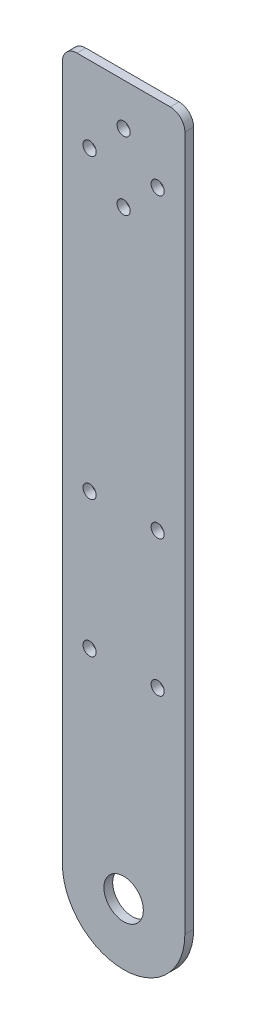
ISO-10303-21;
HEADER;
FILE_DESCRIPTION(('STEP AP214'),'2;1');
FILE_NAME('part.step','',(''),(''),'','','');
FILE_SCHEMA(('AUTOMOTIVE_DESIGN { 1 0 10303 214 1 1 1 1 }'));
ENDSEC;
DATA;
#1=APPLICATION_CONTEXT('core data for automotive mechanical design processes');
#2=APPLICATION_PROTOCOL_DEFINITION('international standard','automotive_design',2000,#1);
#3=PRODUCT_CONTEXT('',#1,'mechanical');
#4=PRODUCT('Part','Part','',(#3));
#5=PRODUCT_RELATED_PRODUCT_CATEGORY('part','',(#4));
#6=PRODUCT_DEFINITION_FORMATION('','',#4);
#7=PRODUCT_DEFINITION_CONTEXT('part definition',#1,'design');
#8=PRODUCT_DEFINITION('design','',#6,#7);
#9=PRODUCT_DEFINITION_SHAPE('','',#8);
#10=(LENGTH_UNIT() NAMED_UNIT(*) SI_UNIT(.MILLI.,.METRE.));
#11=(NAMED_UNIT(*) PLANE_ANGLE_UNIT() SI_UNIT($,.RADIAN.));
#12=(NAMED_UNIT(*) SI_UNIT($,.STERADIAN.) SOLID_ANGLE_UNIT());
#13=UNCERTAINTY_MEASURE_WITH_UNIT(LENGTH_MEASURE(1.E-05),#10,'distance_accuracy_value','');
#14=(GEOMETRIC_REPRESENTATION_CONTEXT(3) GLOBAL_UNCERTAINTY_ASSIGNED_CONTEXT((#13)) GLOBAL_UNIT_ASSIGNED_CONTEXT((#10,
#11,#12)) REPRESENTATION_CONTEXT('',''));
#15=CARTESIAN_POINT('',(0.,0.,0.));
#16=DIRECTION('',(0.,0.,1.));
#17=DIRECTION('',(1.,0.,0.));
#18=AXIS2_PLACEMENT_3D('',#15,#16,#17);
#19=CARTESIAN_POINT('',(0.,0.,1.8));
#20=DIRECTION('',(0.,0.,1.));
#21=DIRECTION('',(1.,0.,0.));
#22=AXIS2_PLACEMENT_3D('',#19,#20,#21);
#23=PLANE('',#22);
#24=CARTESIAN_POINT('',(0.,123.185826180637,1.8));
#25=DIRECTION('',(0.,0.,1.));
#26=DIRECTION('',(-1.,0.,0.));
#27=AXIS2_PLACEMENT_3D('',#24,#25,#26);
#28=CIRCLE('',#27,1.35);
#29=CARTESIAN_POINT('',(-1.35,123.185826180637,1.8));
#30=VERTEX_POINT('',#29);
#31=EDGE_CURVE('E220',#30,#30,#28,.T.);
#32=ORIENTED_EDGE('',*,*,#31,.F.);
#33=EDGE_LOOP('',(#32));
#34=FACE_BOUND('',#33,.T.);
#35=CARTESIAN_POINT('',(0.,137.185826180637,1.8));
#36=DIRECTION('',(0.,0.,1.));
#37=DIRECTION('',(1.,0.,0.));
#38=AXIS2_PLACEMENT_3D('',#35,#36,#37);
#39=CIRCLE('',#38,1.35);
#40=CARTESIAN_POINT('',(1.35,137.185826180637,1.8));
#41=VERTEX_POINT('',#40);
#42=EDGE_CURVE('E204',#41,#41,#39,.T.);
#43=ORIENTED_EDGE('',*,*,#42,.F.);
#44=EDGE_LOOP('',(#43));
#45=FACE_BOUND('',#44,.T.);
#46=CARTESIAN_POINT('',(-6.99999999999998,69.0899815954447,1.8));
#47=DIRECTION('',(0.,0.,1.));
#48=DIRECTION('',(-1.,0.,0.));
#49=AXIS2_PLACEMENT_3D('',#46,#47,#48);
#50=CIRCLE('',#49,1.35);
#51=CARTESIAN_POINT('',(-8.34999999999998,69.0899815954447,1.8));
#52=VERTEX_POINT('',#51);
#53=EDGE_CURVE('E188',#52,#52,#50,.T.);
#54=ORIENTED_EDGE('',*,*,#53,.F.);
#55=EDGE_LOOP('',(#54));
#56=FACE_BOUND('',#55,.T.);
#57=CARTESIAN_POINT('',(7.,69.0899815954447,1.8));
#58=DIRECTION('',(0.,0.,1.));
#59=DIRECTION('',(1.,0.,0.));
#60=AXIS2_PLACEMENT_3D('',#57,#58,#59);
#61=CIRCLE('',#60,1.35);
#62=CARTESIAN_POINT('',(8.35,69.0899815954447,1.8));
#63=VERTEX_POINT('',#62);
#64=EDGE_CURVE('E172',#63,#63,#61,.T.);
#65=ORIENTED_EDGE('',*,*,#64,.F.);
#66=EDGE_LOOP('',(#65));
#67=FACE_BOUND('',#66,.T.);
#68=DIRECTION('',(-1.,0.,0.));
#69=VECTOR('',#68,1.);
#70=CARTESIAN_POINT('',(-12.5961749377996,145.832394840701,1.8));
#71=LINE('',#70,#69);
#72=CARTESIAN_POINT('',(9.59617493779956,145.832394840701,1.8));
#73=VERTEX_POINT('',#72);
#74=CARTESIAN_POINT('',(-9.59617493779957,145.832394840701,1.8));
#75=VERTEX_POINT('',#74);
#76=EDGE_CURVE('E105',#73,#75,#71,.T.);
#77=ORIENTED_EDGE('',*,*,#76,.T.);
#78=CARTESIAN_POINT('',(-9.59617493779957,142.832394840701,1.8));
#79=DIRECTION('',(0.,0.,1.));
#80=DIRECTION('',(1.,0.,0.));
#81=AXIS2_PLACEMENT_3D('',#78,#79,#80);
#82=CIRCLE('',#81,3.);
#83=CARTESIAN_POINT('',(-12.5961749377996,142.832394840701,1.8));
#84=VERTEX_POINT('',#83);
#85=EDGE_CURVE('E11',#75,#84,#82,.T.);
#86=ORIENTED_EDGE('',*,*,#85,.T.);
#87=DIRECTION('',(0.,-1.,0.));
#88=VECTOR('',#87,1.);
#89=CARTESIAN_POINT('',(-12.5961749377996,0.,1.8));
#90=LINE('',#89,#88);
#91=CARTESIAN_POINT('',(-12.5961749377996,0.,1.8));
#92=VERTEX_POINT('',#91);
#93=EDGE_CURVE('E111',#84,#92,#90,.T.);
#94=ORIENTED_EDGE('',*,*,#93,.T.);
#95=CARTESIAN_POINT('',(0.,0.,1.8));
#96=DIRECTION('',(0.,0.,1.));
#97=DIRECTION('',(1.,0.,0.));
#98=AXIS2_PLACEMENT_3D('',#95,#96,#97);
#99=CIRCLE('',#98,12.5961749377996);
#100=CARTESIAN_POINT('',(12.5961749377996,0.,1.8));
#101=VERTEX_POINT('',#100);
#102=EDGE_CURVE('E106',#92,#101,#99,.T.);
#103=ORIENTED_EDGE('',*,*,#102,.T.);
#104=DIRECTION('',(0.,1.,0.));
#105=VECTOR('',#104,1.);
#106=CARTESIAN_POINT('',(12.5961749377996,145.832394840701,1.8));
#107=LINE('',#106,#105);
#108=CARTESIAN_POINT('',(12.5961749377996,142.832394840701,1.8));
#109=VERTEX_POINT('',#108);
#110=EDGE_CURVE('E93',#101,#109,#107,.T.);
#111=ORIENTED_EDGE('',*,*,#110,.T.);
#112=CARTESIAN_POINT('',(9.59617493779957,142.832394840701,1.8));
#113=DIRECTION('',(0.,0.,1.));
#114=DIRECTION('',(1.,0.,0.));
#115=AXIS2_PLACEMENT_3D('',#112,#113,#114);
#116=CIRCLE('',#115,3.);
#117=EDGE_CURVE('E137',#109,#73,#116,.T.);
#118=ORIENTED_EDGE('',*,*,#117,.T.);
#119=EDGE_LOOP('',(#77,#86,#94,#103,#111,#118));
#120=FACE_BOUND('',#119,.T.);
#121=CARTESIAN_POINT('',(7.,41.0899815954447,1.8));
#122=DIRECTION('',(0.,0.,1.));
#123=DIRECTION('',(1.,0.,0.));
#124=AXIS2_PLACEMENT_3D('',#121,#122,#123);
#125=CIRCLE('',#124,1.35);
#126=CARTESIAN_POINT('',(8.35,41.0899815954447,1.8));
#127=VERTEX_POINT('',#126);
#128=EDGE_CURVE('E163',#127,#127,#125,.T.);
#129=ORIENTED_EDGE('',*,*,#128,.F.);
#130=EDGE_LOOP('',(#129));
#131=FACE_BOUND('',#130,.T.);
#132=CARTESIAN_POINT('',(-6.99999999999998,41.0899815954447,1.8));
#133=DIRECTION('',(0.,0.,1.));
#134=DIRECTION('',(-1.,0.,0.));
#135=AXIS2_PLACEMENT_3D('',#132,#133,#134);
#136=CIRCLE('',#135,1.35);
#137=CARTESIAN_POINT('',(-8.34999999999997,41.0899815954447,1.8));
#138=VERTEX_POINT('',#137);
#139=EDGE_CURVE('E180',#138,#138,#136,.T.);
#140=ORIENTED_EDGE('',*,*,#139,.F.);
#141=EDGE_LOOP('',(#140));
#142=FACE_BOUND('',#141,.T.);
#143=CARTESIAN_POINT('',(7.,130.185826180637,1.8));
#144=DIRECTION('',(0.,0.,1.));
#145=DIRECTION('',(1.,0.,0.));
#146=AXIS2_PLACEMENT_3D('',#143,#144,#145);
#147=CIRCLE('',#146,1.35);
#148=CARTESIAN_POINT('',(8.35,130.185826180637,1.8));
#149=VERTEX_POINT('',#148);
#150=EDGE_CURVE('E196',#149,#149,#147,.T.);
#151=ORIENTED_EDGE('',*,*,#150,.F.);
#152=EDGE_LOOP('',(#151));
#153=FACE_BOUND('',#152,.T.);
#154=CARTESIAN_POINT('',(-7.,130.185826180637,1.8));
#155=DIRECTION('',(0.,0.,1.));
#156=DIRECTION('',(-1.,0.,0.));
#157=AXIS2_PLACEMENT_3D('',#154,#155,#156);
#158=CIRCLE('',#157,1.35);
#159=CARTESIAN_POINT('',(-8.35,130.185826180637,1.8));
#160=VERTEX_POINT('',#159);
#161=EDGE_CURVE('E212',#160,#160,#158,.T.);
#162=ORIENTED_EDGE('',*,*,#161,.F.);
#163=EDGE_LOOP('',(#162));
#164=FACE_BOUND('',#163,.T.);
#165=CARTESIAN_POINT('',(0.,0.,1.8));
#166=DIRECTION('',(0.,0.,1.));
#167=DIRECTION('',(1.,0.,0.));
#168=AXIS2_PLACEMENT_3D('',#165,#166,#167);
#169=CIRCLE('',#168,4.05);
#170=CARTESIAN_POINT('',(4.05,0.,1.8));
#171=VERTEX_POINT('',#170);
#172=EDGE_CURVE('E228',#171,#171,#169,.T.);
#173=ORIENTED_EDGE('',*,*,#172,.F.);
#174=EDGE_LOOP('',(#173));
#175=FACE_BOUND('',#174,.T.);
#176=ADVANCED_FACE('F39',(#34,#45,#56,#67,#120,#131,#142,#153,#164,#175),#23,.T.);
#177=CARTESIAN_POINT('',(0.,0.,0.));
#178=DIRECTION('',(0.,0.,1.));
#179=DIRECTION('',(1.,0.,0.));
#180=AXIS2_PLACEMENT_3D('',#177,#178,#179);
#181=PLANE('',#180);
#182=DIRECTION('',(0.,-1.,0.));
#183=VECTOR('',#182,1.);
#184=CARTESIAN_POINT('',(-12.5961749377996,0.,0.));
#185=LINE('',#184,#183);
#186=CARTESIAN_POINT('',(-12.5961749377996,142.832394840701,0.));
#187=VERTEX_POINT('',#186);
#188=CARTESIAN_POINT('',(-12.5961749377996,0.,0.));
#189=VERTEX_POINT('',#188);
#190=EDGE_CURVE('E116',#187,#189,#185,.T.);
#191=ORIENTED_EDGE('',*,*,#190,.F.);
#192=CARTESIAN_POINT('',(-9.59617493779957,142.832394840701,0.));
#193=DIRECTION('',(0.,0.,1.));
#194=DIRECTION('',(1.,0.,0.));
#195=AXIS2_PLACEMENT_3D('',#192,#193,#194);
#196=CIRCLE('',#195,3.);
#197=CARTESIAN_POINT('',(-9.59617493779957,145.832394840701,0.));
#198=VERTEX_POINT('',#197);
#199=EDGE_CURVE('E62',#187,#198,#196,.F.);
#200=ORIENTED_EDGE('',*,*,#199,.T.);
#201=DIRECTION('',(-1.,0.,0.));
#202=VECTOR('',#201,1.);
#203=CARTESIAN_POINT('',(-12.5961749377996,145.832394840701,0.));
#204=LINE('',#203,#202);
#205=CARTESIAN_POINT('',(9.59617493779956,145.832394840701,0.));
#206=VERTEX_POINT('',#205);
#207=EDGE_CURVE('E154',#206,#198,#204,.T.);
#208=ORIENTED_EDGE('',*,*,#207,.F.);
#209=CARTESIAN_POINT('',(9.59617493779957,142.832394840701,0.));
#210=DIRECTION('',(0.,0.,1.));
#211=DIRECTION('',(1.,0.,0.));
#212=AXIS2_PLACEMENT_3D('',#209,#210,#211);
#213=CIRCLE('',#212,3.);
#214=CARTESIAN_POINT('',(12.5961749377996,142.832394840701,0.));
#215=VERTEX_POINT('',#214);
#216=EDGE_CURVE('E128',#206,#215,#213,.F.);
#217=ORIENTED_EDGE('',*,*,#216,.T.);
#218=DIRECTION('',(0.,1.,0.));
#219=VECTOR('',#218,1.);
#220=CARTESIAN_POINT('',(12.5961749377996,145.832394840701,0.));
#221=LINE('',#220,#219);
#222=CARTESIAN_POINT('',(12.5961749377996,0.,0.));
#223=VERTEX_POINT('',#222);
#224=EDGE_CURVE('E156',#223,#215,#221,.T.);
#225=ORIENTED_EDGE('',*,*,#224,.F.);
#226=CARTESIAN_POINT('',(0.,0.,0.));
#227=DIRECTION('',(0.,0.,1.));
#228=DIRECTION('',(1.,0.,0.));
#229=AXIS2_PLACEMENT_3D('',#226,#227,#228);
#230=CIRCLE('',#229,12.5961749377996);
#231=EDGE_CURVE('E120',#189,#223,#230,.T.);
#232=ORIENTED_EDGE('',*,*,#231,.F.);
#233=EDGE_LOOP('',(#191,#200,#208,#217,#225,#232));
#234=FACE_BOUND('',#233,.T.);
#235=CARTESIAN_POINT('',(7.,41.0899815954447,0.));
#236=DIRECTION('',(0.,0.,1.));
#237=DIRECTION('',(1.,0.,0.));
#238=AXIS2_PLACEMENT_3D('',#235,#236,#237);
#239=CIRCLE('',#238,1.35);
#240=CARTESIAN_POINT('',(8.35,41.0899815954447,0.));
#241=VERTEX_POINT('',#240);
#242=EDGE_CURVE('E168',#241,#241,#239,.T.);
#243=ORIENTED_EDGE('',*,*,#242,.T.);
#244=EDGE_LOOP('',(#243));
#245=FACE_BOUND('',#244,.T.);
#246=CARTESIAN_POINT('',(7.,69.0899815954447,0.));
#247=DIRECTION('',(0.,0.,1.));
#248=DIRECTION('',(1.,0.,0.));
#249=AXIS2_PLACEMENT_3D('',#246,#247,#248);
#250=CIRCLE('',#249,1.35);
#251=CARTESIAN_POINT('',(8.35,69.0899815954447,0.));
#252=VERTEX_POINT('',#251);
#253=EDGE_CURVE('E176',#252,#252,#250,.T.);
#254=ORIENTED_EDGE('',*,*,#253,.T.);
#255=EDGE_LOOP('',(#254));
#256=FACE_BOUND('',#255,.T.);
#257=CARTESIAN_POINT('',(-6.99999999999998,41.0899815954447,0.));
#258=DIRECTION('',(0.,0.,1.));
#259=DIRECTION('',(-1.,0.,0.));
#260=AXIS2_PLACEMENT_3D('',#257,#258,#259);
#261=CIRCLE('',#260,1.35);
#262=CARTESIAN_POINT('',(-8.34999999999997,41.0899815954447,0.));
#263=VERTEX_POINT('',#262);
#264=EDGE_CURVE('E184',#263,#263,#261,.T.);
#265=ORIENTED_EDGE('',*,*,#264,.T.);
#266=EDGE_LOOP('',(#265));
#267=FACE_BOUND('',#266,.T.);
#268=CARTESIAN_POINT('',(-6.99999999999998,69.0899815954447,0.));
#269=DIRECTION('',(0.,0.,1.));
#270=DIRECTION('',(-1.,0.,0.));
#271=AXIS2_PLACEMENT_3D('',#268,#269,#270);
#272=CIRCLE('',#271,1.35);
#273=CARTESIAN_POINT('',(-8.34999999999998,69.0899815954447,0.));
#274=VERTEX_POINT('',#273);
#275=EDGE_CURVE('E192',#274,#274,#272,.T.);
#276=ORIENTED_EDGE('',*,*,#275,.T.);
#277=EDGE_LOOP('',(#276));
#278=FACE_BOUND('',#277,.T.);
#279=CARTESIAN_POINT('',(7.,130.185826180637,0.));
#280=DIRECTION('',(0.,0.,1.));
#281=DIRECTION('',(1.,0.,0.));
#282=AXIS2_PLACEMENT_3D('',#279,#280,#281);
#283=CIRCLE('',#282,1.35);
#284=CARTESIAN_POINT('',(8.35,130.185826180637,0.));
#285=VERTEX_POINT('',#284);
#286=EDGE_CURVE('E200',#285,#285,#283,.T.);
#287=ORIENTED_EDGE('',*,*,#286,.T.);
#288=EDGE_LOOP('',(#287));
#289=FACE_BOUND('',#288,.T.);
#290=CARTESIAN_POINT('',(0.,137.185826180637,0.));
#291=DIRECTION('',(0.,0.,1.));
#292=DIRECTION('',(1.,0.,0.));
#293=AXIS2_PLACEMENT_3D('',#290,#291,#292);
#294=CIRCLE('',#293,1.35);
#295=CARTESIAN_POINT('',(1.35,137.185826180637,0.));
#296=VERTEX_POINT('',#295);
#297=EDGE_CURVE('E208',#296,#296,#294,.T.);
#298=ORIENTED_EDGE('',*,*,#297,.T.);
#299=EDGE_LOOP('',(#298));
#300=FACE_BOUND('',#299,.T.);
#301=CARTESIAN_POINT('',(-7.,130.185826180637,0.));
#302=DIRECTION('',(0.,0.,1.));
#303=DIRECTION('',(-1.,0.,0.));
#304=AXIS2_PLACEMENT_3D('',#301,#302,#303);
#305=CIRCLE('',#304,1.35);
#306=CARTESIAN_POINT('',(-8.35,130.185826180637,0.));
#307=VERTEX_POINT('',#306);
#308=EDGE_CURVE('E216',#307,#307,#305,.T.);
#309=ORIENTED_EDGE('',*,*,#308,.T.);
#310=EDGE_LOOP('',(#309));
#311=FACE_BOUND('',#310,.T.);
#312=CARTESIAN_POINT('',(0.,123.185826180637,0.));
#313=DIRECTION('',(0.,0.,1.));
#314=DIRECTION('',(-1.,0.,0.));
#315=AXIS2_PLACEMENT_3D('',#312,#313,#314);
#316=CIRCLE('',#315,1.35);
#317=CARTESIAN_POINT('',(-1.35,123.185826180637,0.));
#318=VERTEX_POINT('',#317);
#319=EDGE_CURVE('E224',#318,#318,#316,.T.);
#320=ORIENTED_EDGE('',*,*,#319,.T.);
#321=EDGE_LOOP('',(#320));
#322=FACE_BOUND('',#321,.T.);
#323=CARTESIAN_POINT('',(0.,0.,0.));
#324=DIRECTION('',(0.,0.,1.));
#325=DIRECTION('',(1.,0.,0.));
#326=AXIS2_PLACEMENT_3D('',#323,#324,#325);
#327=CIRCLE('',#326,4.05);
#328=CARTESIAN_POINT('',(4.05,0.,0.));
#329=VERTEX_POINT('',#328);
#330=EDGE_CURVE('E232',#329,#329,#327,.T.);
#331=ORIENTED_EDGE('',*,*,#330,.T.);
#332=EDGE_LOOP('',(#331));
#333=FACE_BOUND('',#332,.T.);
#334=ADVANCED_FACE('F151',(#234,#245,#256,#267,#278,#289,#300,#311,#322,#333),#181,.F.);
#335=CARTESIAN_POINT('',(0.,0.,1.8));
#336=DIRECTION('',(0.,0.,-1.));
#337=DIRECTION('',(-1.,0.,0.));
#338=AXIS2_PLACEMENT_3D('',#335,#336,#337);
#339=CYLINDRICAL_SURFACE('',#338,12.5961749377996);
#340=ORIENTED_EDGE('',*,*,#231,.T.);
#341=DIRECTION('',(0.,0.,-1.));
#342=VECTOR('',#341,1.);
#343=CARTESIAN_POINT('',(12.5961749377996,0.,1.8));
#344=LINE('',#343,#342);
#345=EDGE_CURVE('E98',#101,#223,#344,.T.);
#346=ORIENTED_EDGE('',*,*,#345,.F.);
#347=ORIENTED_EDGE('',*,*,#102,.F.);
#348=DIRECTION('',(0.,0.,-1.));
#349=VECTOR('',#348,1.);
#350=CARTESIAN_POINT('',(-12.5961749377996,0.,1.8));
#351=LINE('',#350,#349);
#352=EDGE_CURVE('E123',#92,#189,#351,.T.);
#353=ORIENTED_EDGE('',*,*,#352,.T.);
#354=EDGE_LOOP('',(#340,#346,#347,#353));
#355=FACE_BOUND('',#354,.T.);
#356=ADVANCED_FACE('F118',(#355),#339,.T.);
#357=CARTESIAN_POINT('',(12.5961749377996,145.832394840701,1.8));
#358=DIRECTION('',(-1.,0.,0.));
#359=DIRECTION('',(0.,0.,1.));
#360=AXIS2_PLACEMENT_3D('',#357,#358,#359);
#361=PLANE('',#360);
#362=ORIENTED_EDGE('',*,*,#224,.T.);
#363=DIRECTION('',(0.,0.,-1.));
#364=VECTOR('',#363,1.);
#365=CARTESIAN_POINT('',(12.5961749377996,142.832394840701,1.8));
#366=LINE('',#365,#364);
#367=EDGE_CURVE('E101',#215,#109,#366,.F.);
#368=ORIENTED_EDGE('',*,*,#367,.T.);
#369=ORIENTED_EDGE('',*,*,#110,.F.);
#370=ORIENTED_EDGE('',*,*,#345,.T.);
#371=EDGE_LOOP('',(#362,#368,#369,#370));
#372=FACE_BOUND('',#371,.T.);
#373=ADVANCED_FACE('F96',(#372),#361,.F.);
#374=CARTESIAN_POINT('',(-12.5961749377996,145.832394840701,1.8));
#375=DIRECTION('',(0.,-1.,0.));
#376=DIRECTION('',(0.,0.,-1.));
#377=AXIS2_PLACEMENT_3D('',#374,#375,#376);
#378=PLANE('',#377);
#379=ORIENTED_EDGE('',*,*,#207,.T.);
#380=DIRECTION('',(0.,0.,-1.));
#381=VECTOR('',#380,1.);
#382=CARTESIAN_POINT('',(-9.59617493779957,145.832394840701,1.8));
#383=LINE('',#382,#381);
#384=EDGE_CURVE('E48',#198,#75,#383,.F.);
#385=ORIENTED_EDGE('',*,*,#384,.T.);
#386=ORIENTED_EDGE('',*,*,#76,.F.);
#387=DIRECTION('',(0.,0.,-1.));
#388=VECTOR('',#387,1.);
#389=CARTESIAN_POINT('',(9.59617493779957,145.832394840701,1.8));
#390=LINE('',#389,#388);
#391=EDGE_CURVE('E122',#73,#206,#390,.T.);
#392=ORIENTED_EDGE('',*,*,#391,.T.);
#393=EDGE_LOOP('',(#379,#385,#386,#392));
#394=FACE_BOUND('',#393,.T.);
#395=ADVANCED_FACE('F258',(#394),#378,.F.);
#396=CARTESIAN_POINT('',(-12.5961749377996,0.,1.8));
#397=DIRECTION('',(1.,0.,0.));
#398=DIRECTION('',(0.,0.,-1.));
#399=AXIS2_PLACEMENT_3D('',#396,#397,#398);
#400=PLANE('',#399);
#401=ORIENTED_EDGE('',*,*,#93,.F.);
#402=DIRECTION('',(0.,0.,-1.));
#403=VECTOR('',#402,1.);
#404=CARTESIAN_POINT('',(-12.5961749377996,142.832394840701,1.8));
#405=LINE('',#404,#403);
#406=EDGE_CURVE('E140',#84,#187,#405,.T.);
#407=ORIENTED_EDGE('',*,*,#406,.T.);
#408=ORIENTED_EDGE('',*,*,#190,.T.);
#409=ORIENTED_EDGE('',*,*,#352,.F.);
#410=EDGE_LOOP('',(#401,#407,#408,#409));
#411=FACE_BOUND('',#410,.T.);
#412=ADVANCED_FACE('F148',(#411),#400,.F.);
#413=CARTESIAN_POINT('',(7.,41.0899815954447,1.8));
#414=DIRECTION('',(0.,0.,-1.));
#415=DIRECTION('',(-1.,0.,0.));
#416=AXIS2_PLACEMENT_3D('',#413,#414,#415);
#417=CYLINDRICAL_SURFACE('',#416,1.35);
#418=ORIENTED_EDGE('',*,*,#128,.T.);
#419=EDGE_LOOP('',(#418));
#420=FACE_BOUND('',#419,.T.);
#421=ORIENTED_EDGE('',*,*,#242,.F.);
#422=EDGE_LOOP('',(#421));
#423=FACE_BOUND('',#422,.T.);
#424=ADVANCED_FACE('F253',(#420,#423),#417,.F.);
#425=CARTESIAN_POINT('',(7.,69.0899815954447,1.8));
#426=DIRECTION('',(0.,0.,-1.));
#427=DIRECTION('',(-1.,0.,0.));
#428=AXIS2_PLACEMENT_3D('',#425,#426,#427);
#429=CYLINDRICAL_SURFACE('',#428,1.35);
#430=ORIENTED_EDGE('',*,*,#64,.T.);
#431=EDGE_LOOP('',(#430));
#432=FACE_BOUND('',#431,.T.);
#433=ORIENTED_EDGE('',*,*,#253,.F.);
#434=EDGE_LOOP('',(#433));
#435=FACE_BOUND('',#434,.T.);
#436=ADVANCED_FACE('F298',(#432,#435),#429,.F.);
#437=CARTESIAN_POINT('',(-6.99999999999998,41.0899815954447,1.8));
#438=DIRECTION('',(0.,0.,-1.));
#439=DIRECTION('',(-1.,0.,0.));
#440=AXIS2_PLACEMENT_3D('',#437,#438,#439);
#441=CYLINDRICAL_SURFACE('',#440,1.35);
#442=ORIENTED_EDGE('',*,*,#139,.T.);
#443=EDGE_LOOP('',(#442));
#444=FACE_BOUND('',#443,.T.);
#445=ORIENTED_EDGE('',*,*,#264,.F.);
#446=EDGE_LOOP('',(#445));
#447=FACE_BOUND('',#446,.T.);
#448=ADVANCED_FACE('F295',(#444,#447),#441,.F.);
#449=CARTESIAN_POINT('',(-6.99999999999998,69.0899815954447,1.8));
#450=DIRECTION('',(0.,0.,-1.));
#451=DIRECTION('',(-1.,0.,0.));
#452=AXIS2_PLACEMENT_3D('',#449,#450,#451);
#453=CYLINDRICAL_SURFACE('',#452,1.35);
#454=ORIENTED_EDGE('',*,*,#53,.T.);
#455=EDGE_LOOP('',(#454));
#456=FACE_BOUND('',#455,.T.);
#457=ORIENTED_EDGE('',*,*,#275,.F.);
#458=EDGE_LOOP('',(#457));
#459=FACE_BOUND('',#458,.T.);
#460=ADVANCED_FACE('F291',(#456,#459),#453,.F.);
#461=CARTESIAN_POINT('',(7.,130.185826180637,1.8));
#462=DIRECTION('',(0.,0.,-1.));
#463=DIRECTION('',(-1.,0.,0.));
#464=AXIS2_PLACEMENT_3D('',#461,#462,#463);
#465=CYLINDRICAL_SURFACE('',#464,1.35);
#466=ORIENTED_EDGE('',*,*,#150,.T.);
#467=EDGE_LOOP('',(#466));
#468=FACE_BOUND('',#467,.T.);
#469=ORIENTED_EDGE('',*,*,#286,.F.);
#470=EDGE_LOOP('',(#469));
#471=FACE_BOUND('',#470,.T.);
#472=ADVANCED_FACE('F287',(#468,#471),#465,.F.);
#473=CARTESIAN_POINT('',(0.,137.185826180637,1.8));
#474=DIRECTION('',(0.,0.,-1.));
#475=DIRECTION('',(-1.,0.,0.));
#476=AXIS2_PLACEMENT_3D('',#473,#474,#475);
#477=CYLINDRICAL_SURFACE('',#476,1.35);
#478=ORIENTED_EDGE('',*,*,#42,.T.);
#479=EDGE_LOOP('',(#478));
#480=FACE_BOUND('',#479,.T.);
#481=ORIENTED_EDGE('',*,*,#297,.F.);
#482=EDGE_LOOP('',(#481));
#483=FACE_BOUND('',#482,.T.);
#484=ADVANCED_FACE('F283',(#480,#483),#477,.F.);
#485=CARTESIAN_POINT('',(-7.,130.185826180637,1.8));
#486=DIRECTION('',(0.,0.,-1.));
#487=DIRECTION('',(-1.,0.,0.));
#488=AXIS2_PLACEMENT_3D('',#485,#486,#487);
#489=CYLINDRICAL_SURFACE('',#488,1.35);
#490=ORIENTED_EDGE('',*,*,#161,.T.);
#491=EDGE_LOOP('',(#490));
#492=FACE_BOUND('',#491,.T.);
#493=ORIENTED_EDGE('',*,*,#308,.F.);
#494=EDGE_LOOP('',(#493));
#495=FACE_BOUND('',#494,.T.);
#496=ADVANCED_FACE('F277',(#492,#495),#489,.F.);
#497=CARTESIAN_POINT('',(0.,123.185826180637,1.8));
#498=DIRECTION('',(0.,0.,-1.));
#499=DIRECTION('',(-1.,0.,0.));
#500=AXIS2_PLACEMENT_3D('',#497,#498,#499);
#501=CYLINDRICAL_SURFACE('',#500,1.35);
#502=ORIENTED_EDGE('',*,*,#31,.T.);
#503=EDGE_LOOP('',(#502));
#504=FACE_BOUND('',#503,.T.);
#505=ORIENTED_EDGE('',*,*,#319,.F.);
#506=EDGE_LOOP('',(#505));
#507=FACE_BOUND('',#506,.T.);
#508=ADVANCED_FACE('F271',(#504,#507),#501,.F.);
#509=CARTESIAN_POINT('',(0.,0.,1.8));
#510=DIRECTION('',(0.,0.,-1.));
#511=DIRECTION('',(-1.,0.,0.));
#512=AXIS2_PLACEMENT_3D('',#509,#510,#511);
#513=CYLINDRICAL_SURFACE('',#512,4.05);
#514=ORIENTED_EDGE('',*,*,#172,.T.);
#515=EDGE_LOOP('',(#514));
#516=FACE_BOUND('',#515,.T.);
#517=ORIENTED_EDGE('',*,*,#330,.F.);
#518=EDGE_LOOP('',(#517));
#519=FACE_BOUND('',#518,.T.);
#520=ADVANCED_FACE('F240',(#516,#519),#513,.F.);
#521=CARTESIAN_POINT('',(9.59617493779957,142.832394840701,1.8));
#522=DIRECTION('',(0.,0.,-1.));
#523=DIRECTION('',(-1.,0.,0.));
#524=AXIS2_PLACEMENT_3D('',#521,#522,#523);
#525=CYLINDRICAL_SURFACE('',#524,3.);
#526=ORIENTED_EDGE('',*,*,#117,.F.);
#527=ORIENTED_EDGE('',*,*,#367,.F.);
#528=ORIENTED_EDGE('',*,*,#216,.F.);
#529=ORIENTED_EDGE('',*,*,#391,.F.);
#530=EDGE_LOOP('',(#526,#527,#528,#529));
#531=FACE_BOUND('',#530,.T.);
#532=ADVANCED_FACE('F264',(#531),#525,.T.);
#533=CARTESIAN_POINT('',(-9.59617493779957,142.832394840701,1.8));
#534=DIRECTION('',(0.,0.,-1.));
#535=DIRECTION('',(-1.,0.,0.));
#536=AXIS2_PLACEMENT_3D('',#533,#534,#535);
#537=CYLINDRICAL_SURFACE('',#536,3.);
#538=ORIENTED_EDGE('',*,*,#85,.F.);
#539=ORIENTED_EDGE('',*,*,#384,.F.);
#540=ORIENTED_EDGE('',*,*,#199,.F.);
#541=ORIENTED_EDGE('',*,*,#406,.F.);
#542=EDGE_LOOP('',(#538,#539,#540,#541));
#543=FACE_BOUND('',#542,.T.);
#544=ADVANCED_FACE('F41',(#543),#537,.T.);
#545=CLOSED_SHELL('',(#176,#334,#356,#373,#395,#412,#424,#436,#448,#460,#472,#484,#496,#508,
#520,#532,#544));
#546=MANIFOLD_SOLID_BREP('B2',#545);
#547=ADVANCED_BREP_SHAPE_REPRESENTATION('',(#18,#546),#14);
#548=SHAPE_DEFINITION_REPRESENTATION(#9,#547);
ENDSEC;
END-ISO-10303-21;
